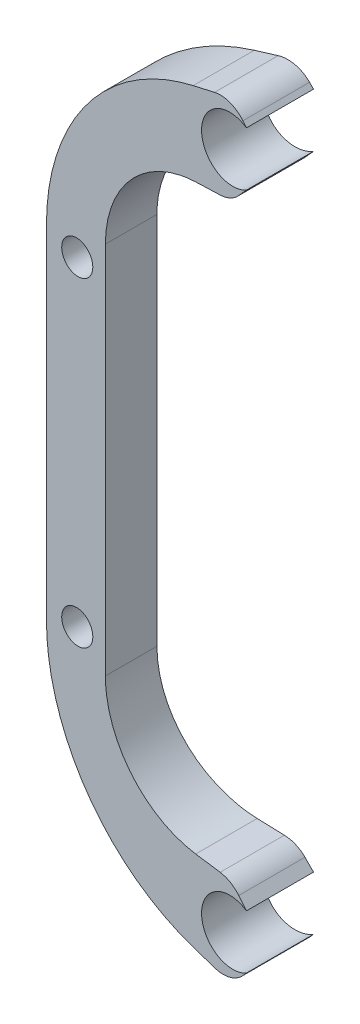
ISO-10303-21;
HEADER;
FILE_DESCRIPTION(('STEP AP214'),'2;1');
FILE_NAME('part.step','',(''),(''),'','','');
FILE_SCHEMA(('AUTOMOTIVE_DESIGN { 1 0 10303 214 1 1 1 1 }'));
ENDSEC;
DATA;
#1=APPLICATION_CONTEXT('core data for automotive mechanical design processes');
#2=APPLICATION_PROTOCOL_DEFINITION('international standard','automotive_design',2000,#1);
#3=PRODUCT_CONTEXT('',#1,'mechanical');
#4=PRODUCT('Part','Part','',(#3));
#5=PRODUCT_RELATED_PRODUCT_CATEGORY('part','',(#4));
#6=PRODUCT_DEFINITION_FORMATION('','',#4);
#7=PRODUCT_DEFINITION_CONTEXT('part definition',#1,'design');
#8=PRODUCT_DEFINITION('design','',#6,#7);
#9=PRODUCT_DEFINITION_SHAPE('','',#8);
#10=(LENGTH_UNIT() NAMED_UNIT(*) SI_UNIT(.MILLI.,.METRE.));
#11=(NAMED_UNIT(*) PLANE_ANGLE_UNIT() SI_UNIT($,.RADIAN.));
#12=(NAMED_UNIT(*) SI_UNIT($,.STERADIAN.) SOLID_ANGLE_UNIT());
#13=UNCERTAINTY_MEASURE_WITH_UNIT(LENGTH_MEASURE(1.E-05),#10,'distance_accuracy_value','');
#14=(GEOMETRIC_REPRESENTATION_CONTEXT(3) GLOBAL_UNCERTAINTY_ASSIGNED_CONTEXT((#13)) GLOBAL_UNIT_ASSIGNED_CONTEXT((#10,
#11,#12)) REPRESENTATION_CONTEXT('',''));
#15=CARTESIAN_POINT('',(0.,0.,0.));
#16=DIRECTION('',(0.,0.,1.));
#17=DIRECTION('',(1.,0.,0.));
#18=AXIS2_PLACEMENT_3D('',#15,#16,#17);
#19=CARTESIAN_POINT('',(6.01748699128147,16.7888100311249,4.5));
#20=DIRECTION('',(0.,0.,-1.));
#21=DIRECTION('',(-1.,0.,0.));
#22=AXIS2_PLACEMENT_3D('',#19,#20,#21);
#23=CYLINDRICAL_SURFACE('',#22,2.1);
#24=DIRECTION('',(0.,0.,-1.));
#25=VECTOR('',#24,1.);
#26=CARTESIAN_POINT('',(7.0893845411661,14.9829762506924,4.5));
#27=LINE('',#26,#25);
#28=CARTESIAN_POINT('',(7.0893845411661,14.9829762506924,4.5));
#29=VERTEX_POINT('',#28);
#30=CARTESIAN_POINT('',(7.0893845411661,14.9829762506924,0.));
#31=VERTEX_POINT('',#30);
#32=EDGE_CURVE('E219',#29,#31,#27,.T.);
#33=ORIENTED_EDGE('',*,*,#32,.T.);
#34=CARTESIAN_POINT('',(6.01748699128147,16.7888100311249,0.0561757702083878));
#35=DIRECTION('',(0.0523359562429444,0.,0.998629534754574));
#36=DIRECTION('',(0.998629534754574,0.,-0.0523359562429444));
#37=AXIS2_PLACEMENT_3D('',#34,#35,#36);
#38=ELLIPSE('',#37,2.10288192659563,2.1);
#39=CARTESIAN_POINT('',(7.0893845411661,18.5946438115575,0.));
#40=VERTEX_POINT('',#39);
#41=EDGE_CURVE('E364',#31,#40,#38,.F.);
#42=ORIENTED_EDGE('',*,*,#41,.T.);
#43=DIRECTION('',(0.,0.,-1.));
#44=VECTOR('',#43,1.);
#45=CARTESIAN_POINT('',(7.0893845411661,18.5946438115575,4.5));
#46=LINE('',#45,#44);
#47=CARTESIAN_POINT('',(7.0893845411661,18.5946438115575,4.5));
#48=VERTEX_POINT('',#47);
#49=EDGE_CURVE('E390',#48,#40,#46,.T.);
#50=ORIENTED_EDGE('',*,*,#49,.F.);
#51=CARTESIAN_POINT('',(6.01748699128147,16.7888100311249,4.44382422979162));
#52=DIRECTION('',(0.0523359562429369,0.,-0.998629534754574));
#53=DIRECTION('',(-0.998629534754574,0.,-0.0523359562429369));
#54=AXIS2_PLACEMENT_3D('',#51,#52,#53);
#55=ELLIPSE('',#54,2.10288192659563,2.1);
#56=EDGE_CURVE('E320',#48,#29,#55,.F.);
#57=ORIENTED_EDGE('',*,*,#56,.T.);
#58=EDGE_LOOP('',(#33,#42,#50,#57));
#59=FACE_BOUND('',#58,.T.);
#60=ADVANCED_FACE('F35',(#59),#23,.F.);
#61=CARTESIAN_POINT('',(5.0565748173918,15.7123807843522,4.5));
#62=DIRECTION('',(0.,0.,-1.));
#63=DIRECTION('',(-1.,0.,0.));
#64=AXIS2_PLACEMENT_3D('',#61,#62,#63);
#65=CYLINDRICAL_SURFACE('',#64,2.);
#66=CARTESIAN_POINT('',(5.0565748173918,15.7123807843522,0.106535043327985));
#67=DIRECTION('',(0.0523359562429444,0.,0.998629534754574));
#68=DIRECTION('',(0.998629534754574,0.,-0.0523359562429444));
#69=AXIS2_PLACEMENT_3D('',#66,#67,#68);
#70=ELLIPSE('',#69,2.00274469199584,2.);
#71=CARTESIAN_POINT('',(6.5449293244767,14.37641639065,0.0285336888257593));
#72=VERTEX_POINT('',#71);
#73=CARTESIAN_POINT('',(5.23088630288712,13.7199913881687,0.0973997654696475));
#74=VERTEX_POINT('',#73);
#75=EDGE_CURVE('E357',#72,#74,#70,.F.);
#76=ORIENTED_EDGE('',*,*,#75,.F.);
#77=DIRECTION('',(0.,0.,-1.));
#78=VECTOR('',#77,1.);
#79=CARTESIAN_POINT('',(6.5449293244767,14.37641639065,4.5));
#80=LINE('',#79,#78);
#81=CARTESIAN_POINT('',(6.5449293244767,14.37641639065,4.47146631117425));
#82=VERTEX_POINT('',#81);
#83=EDGE_CURVE('E249',#82,#72,#80,.T.);
#84=ORIENTED_EDGE('',*,*,#83,.F.);
#85=CARTESIAN_POINT('',(5.0565748173918,15.7123807843522,4.39346495667203));
#86=DIRECTION('',(0.0523359562429369,0.,-0.998629534754574));
#87=DIRECTION('',(-0.998629534754574,0.,-0.0523359562429369));
#88=AXIS2_PLACEMENT_3D('',#85,#86,#87);
#89=ELLIPSE('',#88,2.00274469199584,2.);
#90=CARTESIAN_POINT('',(5.23088630288712,13.7199913881687,4.40260023453037));
#91=VERTEX_POINT('',#90);
#92=EDGE_CURVE('E308',#91,#82,#89,.F.);
#93=ORIENTED_EDGE('',*,*,#92,.F.);
#94=DIRECTION('',(0.,0.,-1.));
#95=VECTOR('',#94,1.);
#96=CARTESIAN_POINT('',(5.23088630288712,13.7199913881687,4.5));
#97=LINE('',#96,#95);
#98=EDGE_CURVE('E252',#74,#91,#97,.F.);
#99=ORIENTED_EDGE('',*,*,#98,.F.);
#100=EDGE_LOOP('',(#76,#84,#93,#99));
#101=FACE_BOUND('',#100,.T.);
#102=ADVANCED_FACE('F402',(#101),#65,.T.);
#103=CARTESIAN_POINT('',(6.01748699128146,13.7888100311249,4.5));
#104=DIRECTION('',(-0.744177253542452,0.667982196851093,0.));
#105=DIRECTION('',(-0.667982196851093,-0.744177253542452,0.));
#106=AXIS2_PLACEMENT_3D('',#103,#104,#105);
#107=PLANE('',#106);
#108=ORIENTED_EDGE('',*,*,#83,.T.);
#109=DIRECTION('',(0.667573259077529,0.743721669260962,-0.034986032016996));
#110=VECTOR('',#109,1.);
#111=CARTESIAN_POINT('',(5.91369819056094,13.6731823017741,0.0616151107686001));
#112=LINE('',#111,#110);
#113=EDGE_CURVE('E361',#72,#31,#112,.T.);
#114=ORIENTED_EDGE('',*,*,#113,.T.);
#115=ORIENTED_EDGE('',*,*,#32,.F.);
#116=DIRECTION('',(-0.667573259077529,-0.743721669260962,-0.034986032016991));
#117=VECTOR('',#116,1.);
#118=CARTESIAN_POINT('',(6.01879901793193,13.7902717173703,4.44389299019473));
#119=LINE('',#118,#117);
#120=EDGE_CURVE('E312',#29,#82,#119,.T.);
#121=ORIENTED_EDGE('',*,*,#120,.T.);
#122=EDGE_LOOP('',(#108,#114,#115,#121));
#123=FACE_BOUND('',#122,.T.);
#124=ADVANCED_FACE('F397',(#123),#107,.F.);
#125=CARTESIAN_POINT('',(4.11252473120093,6.59540856611972,4.5));
#126=DIRECTION('',(0.,0.,1.));
#127=DIRECTION('',(1.,0.,0.));
#128=AXIS2_PLACEMENT_3D('',#125,#126,#127);
#129=CYLINDRICAL_SURFACE('',#128,7.);
#130=DIRECTION('',(0.,0.,-1.));
#131=VECTOR('',#130,1.);
#132=CARTESIAN_POINT('',(-2.88747526879907,6.59540856611972,4.5));
#133=LINE('',#132,#131);
#134=CARTESIAN_POINT('',(-2.88747526879907,6.59540856611972,0.522865066858506));
#135=VERTEX_POINT('',#134);
#136=CARTESIAN_POINT('',(-2.88747526879907,6.59540856611972,3.97713493314157));
#137=VERTEX_POINT('',#136);
#138=EDGE_CURVE('E225',#135,#137,#133,.F.);
#139=ORIENTED_EDGE('',*,*,#138,.F.);
#140=CARTESIAN_POINT('',(4.11252473120093,6.59540856611972,0.156010611877213));
#141=DIRECTION('',(0.0523359562429444,0.,0.998629534754574));
#142=DIRECTION('',(-0.998629534754574,0.,0.0523359562429444));
#143=AXIS2_PLACEMENT_3D('',#140,#141,#142);
#144=ELLIPSE('',#143,7.00960642198545,7.);
#145=CARTESIAN_POINT('',(3.50243453196729,13.5687714527619,0.187984084381396));
#146=VERTEX_POINT('',#145);
#147=EDGE_CURVE('E343',#135,#146,#144,.F.);
#148=ORIENTED_EDGE('',*,*,#147,.T.);
#149=DIRECTION('',(0.,0.,-1.));
#150=VECTOR('',#149,1.);
#151=CARTESIAN_POINT('',(3.50243453196729,13.5687714527619,0.));
#152=LINE('',#151,#150);
#153=CARTESIAN_POINT('',(3.50243453196729,13.5687714527619,4.31201591561863));
#154=VERTEX_POINT('',#153);
#155=EDGE_CURVE('E214',#154,#146,#152,.T.);
#156=ORIENTED_EDGE('',*,*,#155,.F.);
#157=CARTESIAN_POINT('',(4.11252473120093,6.59540856611972,4.34398938812281));
#158=DIRECTION('',(0.0523359562429369,0.,-0.998629534754574));
#159=DIRECTION('',(0.998629534754574,0.,0.0523359562429369));
#160=AXIS2_PLACEMENT_3D('',#157,#158,#159);
#161=ELLIPSE('',#160,7.00960642198544,7.);
#162=EDGE_CURVE('E295',#154,#137,#161,.F.);
#163=ORIENTED_EDGE('',*,*,#162,.T.);
#164=EDGE_LOOP('',(#139,#148,#156,#163));
#165=FACE_BOUND('',#164,.T.);
#166=ADVANCED_FACE('F409',(#165),#129,.F.);
#167=CARTESIAN_POINT('',(-2.88747526879907,13.0097267842417,4.5));
#168=DIRECTION('',(-0.0871557427476618,0.996194698091745,0.));
#169=DIRECTION('',(-0.996194698091745,-0.0871557427476618,0.));
#170=AXIS2_PLACEMENT_3D('',#167,#168,#169);
#171=PLANE('',#170);
#172=ORIENTED_EDGE('',*,*,#155,.T.);
#173=DIRECTION('',(0.994839797341938,0.0870372042918509,-0.0521373445210823));
#174=VECTOR('',#173,1.);
#175=CARTESIAN_POINT('',(-3.09376251756073,12.9916789885451,0.533676123460512));
#176=LINE('',#175,#174);
#177=EDGE_CURVE('E351',#146,#74,#176,.T.);
#178=ORIENTED_EDGE('',*,*,#177,.T.);
#179=ORIENTED_EDGE('',*,*,#98,.T.);
#180=DIRECTION('',(-0.994839797341939,-0.087037204291851,-0.0521373445210748));
#181=VECTOR('',#180,1.);
#182=CARTESIAN_POINT('',(-2.86035514390288,13.0120994877235,3.97855623866126));
#183=LINE('',#182,#181);
#184=EDGE_CURVE('E302',#91,#154,#183,.T.);
#185=ORIENTED_EDGE('',*,*,#184,.T.);
#186=EDGE_LOOP('',(#172,#178,#179,#185));
#187=FACE_BOUND('',#186,.T.);
#188=ADVANCED_FACE('F405',(#187),#171,.F.);
#189=CARTESIAN_POINT('',(4.11252473120093,-18.4777885038699,4.5));
#190=DIRECTION('',(0.,0.,1.));
#191=DIRECTION('',(1.,0.,0.));
#192=AXIS2_PLACEMENT_3D('',#189,#190,#191);
#193=CYLINDRICAL_SURFACE('',#192,7.);
#194=DIRECTION('',(0.,0.,-1.));
#195=VECTOR('',#194,1.);
#196=CARTESIAN_POINT('',(3.50243453196729,-25.4511513905121,4.5));
#197=LINE('',#196,#195);
#198=CARTESIAN_POINT('',(3.50243453196729,-25.4511513905121,0.187984084381396));
#199=VERTEX_POINT('',#198);
#200=CARTESIAN_POINT('',(3.50243453196729,-25.4511513905121,4.31201591561863));
#201=VERTEX_POINT('',#200);
#202=EDGE_CURVE('E228',#199,#201,#197,.F.);
#203=ORIENTED_EDGE('',*,*,#202,.F.);
#204=CARTESIAN_POINT('',(4.11252473120093,-18.4777885038699,0.156010611877213));
#205=DIRECTION('',(0.0523359562429444,0.,0.998629534754574));
#206=DIRECTION('',(-0.998629534754574,0.,0.0523359562429444));
#207=AXIS2_PLACEMENT_3D('',#204,#205,#206);
#208=ELLIPSE('',#207,7.00960642198545,7.);
#209=CARTESIAN_POINT('',(-2.88747526879907,-18.4777885038699,0.522865066858505));
#210=VERTEX_POINT('',#209);
#211=EDGE_CURVE('E340',#199,#210,#208,.F.);
#212=ORIENTED_EDGE('',*,*,#211,.T.);
#213=DIRECTION('',(0.,0.,-1.));
#214=VECTOR('',#213,1.);
#215=CARTESIAN_POINT('',(-2.88747526879907,-18.4777885038699,0.));
#216=LINE('',#215,#214);
#217=CARTESIAN_POINT('',(-2.88747526879907,-18.4777885038699,3.97713493314157));
#218=VERTEX_POINT('',#217);
#219=EDGE_CURVE('E217',#218,#210,#216,.T.);
#220=ORIENTED_EDGE('',*,*,#219,.F.);
#221=CARTESIAN_POINT('',(4.11252473120093,-18.4777885038699,4.34398938812281));
#222=DIRECTION('',(0.0523359562429369,0.,-0.998629534754574));
#223=DIRECTION('',(0.998629534754574,0.,0.0523359562429369));
#224=AXIS2_PLACEMENT_3D('',#221,#222,#223);
#225=ELLIPSE('',#224,7.00960642198544,7.);
#226=EDGE_CURVE('E198',#218,#201,#225,.F.);
#227=ORIENTED_EDGE('',*,*,#226,.T.);
#228=EDGE_LOOP('',(#203,#212,#220,#227));
#229=FACE_BOUND('',#228,.T.);
#230=ADVANCED_FACE('F414',(#229),#193,.F.);
#231=CARTESIAN_POINT('',(-2.88747526879907,-24.8921067219918,4.5));
#232=DIRECTION('',(-1.,0.,0.));
#233=DIRECTION('',(0.,-1.,0.));
#234=AXIS2_PLACEMENT_3D('',#231,#232,#233);
#235=PLANE('',#234);
#236=ORIENTED_EDGE('',*,*,#219,.T.);
#237=DIRECTION('',(0.,1.,0.));
#238=VECTOR('',#237,1.);
#239=CARTESIAN_POINT('',(-2.88747526879907,-24.8921067219918,0.522865066858506));
#240=LINE('',#239,#238);
#241=EDGE_CURVE('E344',#210,#135,#240,.T.);
#242=ORIENTED_EDGE('',*,*,#241,.T.);
#243=ORIENTED_EDGE('',*,*,#138,.T.);
#244=DIRECTION('',(0.,-1.,0.));
#245=VECTOR('',#244,1.);
#246=CARTESIAN_POINT('',(-2.88747526879907,-24.8921067219918,3.97713493314157));
#247=LINE('',#246,#245);
#248=EDGE_CURVE('E296',#137,#218,#247,.T.);
#249=ORIENTED_EDGE('',*,*,#248,.T.);
#250=EDGE_LOOP('',(#236,#242,#243,#249));
#251=FACE_BOUND('',#250,.T.);
#252=ADVANCED_FACE('F411',(#251),#235,.F.);
#253=CARTESIAN_POINT('',(5.0565748173918,-27.5947607221024,4.5));
#254=DIRECTION('',(0.,0.,-1.));
#255=DIRECTION('',(-1.,0.,0.));
#256=AXIS2_PLACEMENT_3D('',#253,#254,#255);
#257=CYLINDRICAL_SURFACE('',#256,2.);
#258=CARTESIAN_POINT('',(5.0565748173918,-27.5947607221024,0.106535043327985));
#259=DIRECTION('',(0.0523359562429444,0.,0.998629534754574));
#260=DIRECTION('',(0.998629534754574,0.,-0.0523359562429444));
#261=AXIS2_PLACEMENT_3D('',#258,#259,#260);
#262=ELLIPSE('',#261,2.00274469199584,2.);
#263=CARTESIAN_POINT('',(5.23088630288713,-25.6023713259189,0.0973997654696466));
#264=VERTEX_POINT('',#263);
#265=CARTESIAN_POINT('',(6.54492932447671,-26.2587963284002,0.0285336888257593));
#266=VERTEX_POINT('',#265);
#267=EDGE_CURVE('E43',#264,#266,#262,.F.);
#268=ORIENTED_EDGE('',*,*,#267,.F.);
#269=DIRECTION('',(0.,0.,-1.));
#270=VECTOR('',#269,1.);
#271=CARTESIAN_POINT('',(5.23088630288713,-25.6023713259189,4.5));
#272=LINE('',#271,#270);
#273=CARTESIAN_POINT('',(5.23088630288713,-25.6023713259189,4.40260023453037));
#274=VERTEX_POINT('',#273);
#275=EDGE_CURVE('E260',#274,#264,#272,.T.);
#276=ORIENTED_EDGE('',*,*,#275,.F.);
#277=CARTESIAN_POINT('',(5.0565748173918,-27.5947607221024,4.39346495667203));
#278=DIRECTION('',(0.0523359562429369,0.,-0.998629534754574));
#279=DIRECTION('',(-0.998629534754574,0.,-0.0523359562429369));
#280=AXIS2_PLACEMENT_3D('',#277,#278,#279);
#281=ELLIPSE('',#280,2.00274469199584,2.);
#282=CARTESIAN_POINT('',(6.54492932447671,-26.2587963284002,4.47146631117424));
#283=VERTEX_POINT('',#282);
#284=EDGE_CURVE('E266',#283,#274,#281,.F.);
#285=ORIENTED_EDGE('',*,*,#284,.F.);
#286=DIRECTION('',(0.,0.,-1.));
#287=VECTOR('',#286,1.);
#288=CARTESIAN_POINT('',(6.54492932447671,-26.2587963284002,4.5));
#289=LINE('',#288,#287);
#290=EDGE_CURVE('E263',#266,#283,#289,.F.);
#291=ORIENTED_EDGE('',*,*,#290,.F.);
#292=EDGE_LOOP('',(#268,#276,#285,#291));
#293=FACE_BOUND('',#292,.T.);
#294=ADVANCED_FACE('F37',(#293),#257,.T.);
#295=CARTESIAN_POINT('',(6.01748699128147,-25.6711899688751,4.5));
#296=DIRECTION('',(-0.0871557427476625,-0.996194698091745,0.));
#297=DIRECTION('',(0.996194698091745,-0.0871557427476625,0.));
#298=AXIS2_PLACEMENT_3D('',#295,#296,#297);
#299=PLANE('',#298);
#300=ORIENTED_EDGE('',*,*,#275,.T.);
#301=DIRECTION('',(-0.994839797341938,0.0870372042918516,0.0521373445210823));
#302=VECTOR('',#301,1.);
#303=CARTESIAN_POINT('',(5.78699335962085,-25.6510243890899,0.0682554295826036));
#304=LINE('',#303,#302);
#305=EDGE_CURVE('E273',#264,#199,#304,.T.);
#306=ORIENTED_EDGE('',*,*,#305,.T.);
#307=ORIENTED_EDGE('',*,*,#202,.T.);
#308=DIRECTION('',(0.994839797341938,-0.0870372042918516,0.0521373445210748));
#309=VECTOR('',#308,1.);
#310=CARTESIAN_POINT('',(6.0204007332787,-25.6714448882683,4.4439769325391));
#311=LINE('',#310,#309);
#312=EDGE_CURVE('E283',#201,#274,#311,.T.);
#313=ORIENTED_EDGE('',*,*,#312,.T.);
#314=EDGE_LOOP('',(#300,#306,#307,#313));
#315=FACE_BOUND('',#314,.T.);
#316=ADVANCED_FACE('F286',(#315),#299,.F.);
#317=CARTESIAN_POINT('',(6.01748699128147,-25.6711899688751,4.5));
#318=DIRECTION('',(-0.744177253542451,-0.667982196851094,0.));
#319=DIRECTION('',(0.667982196851094,-0.744177253542451,0.));
#320=AXIS2_PLACEMENT_3D('',#317,#318,#319);
#321=PLANE('',#320);
#322=DIRECTION('',(0.,0.,-1.));
#323=VECTOR('',#322,1.);
#324=CARTESIAN_POINT('',(7.0893845411661,-26.8653561884425,4.5));
#325=LINE('',#324,#323);
#326=CARTESIAN_POINT('',(7.0893845411661,-26.8653561884425,4.5));
#327=VERTEX_POINT('',#326);
#328=CARTESIAN_POINT('',(7.0893845411661,-26.8653561884425,0.));
#329=VERTEX_POINT('',#328);
#330=EDGE_CURVE('E207',#327,#329,#325,.T.);
#331=ORIENTED_EDGE('',*,*,#330,.T.);
#332=DIRECTION('',(-0.66757325907753,0.743721669260961,0.034986032016996));
#333=VECTOR('',#332,1.);
#334=CARTESIAN_POINT('',(5.91369819056094,-25.5555622395243,0.0616151107685993));
#335=LINE('',#334,#333);
#336=EDGE_CURVE('E271',#329,#266,#335,.T.);
#337=ORIENTED_EDGE('',*,*,#336,.T.);
#338=ORIENTED_EDGE('',*,*,#290,.T.);
#339=DIRECTION('',(0.66757325907753,-0.743721669260961,0.034986032016991));
#340=VECTOR('',#339,1.);
#341=CARTESIAN_POINT('',(6.01879901793194,-25.6726516551205,4.44389299019473));
#342=LINE('',#341,#340);
#343=EDGE_CURVE('E208',#283,#327,#342,.T.);
#344=ORIENTED_EDGE('',*,*,#343,.T.);
#345=EDGE_LOOP('',(#331,#337,#338,#344));
#346=FACE_BOUND('',#345,.T.);
#347=ADVANCED_FACE('F278',(#346),#321,.F.);
#348=CARTESIAN_POINT('',(6.01748699128147,-28.6711899688751,4.5));
#349=DIRECTION('',(0.,0.,-1.));
#350=DIRECTION('',(-1.,0.,0.));
#351=AXIS2_PLACEMENT_3D('',#348,#349,#350);
#352=CYLINDRICAL_SURFACE('',#351,2.1);
#353=DIRECTION('',(0.,0.,-1.));
#354=VECTOR('',#353,1.);
#355=CARTESIAN_POINT('',(7.0893845411661,-30.4770237493076,4.5));
#356=LINE('',#355,#354);
#357=CARTESIAN_POINT('',(7.0893845411661,-30.4770237493076,4.5));
#358=VERTEX_POINT('',#357);
#359=CARTESIAN_POINT('',(7.0893845411661,-30.4770237493076,0.));
#360=VERTEX_POINT('',#359);
#361=EDGE_CURVE('E205',#358,#360,#356,.T.);
#362=ORIENTED_EDGE('',*,*,#361,.T.);
#363=CARTESIAN_POINT('',(6.01748699128147,-28.6711899688751,0.056175770208387));
#364=DIRECTION('',(0.0523359562429444,0.,0.998629534754574));
#365=DIRECTION('',(0.998629534754574,0.,-0.0523359562429444));
#366=AXIS2_PLACEMENT_3D('',#363,#364,#365);
#367=ELLIPSE('',#366,2.10288192659563,2.1);
#368=EDGE_CURVE('E279',#360,#329,#367,.F.);
#369=ORIENTED_EDGE('',*,*,#368,.T.);
#370=ORIENTED_EDGE('',*,*,#330,.F.);
#371=CARTESIAN_POINT('',(6.01748699128147,-28.6711899688751,4.44382422979162));
#372=DIRECTION('',(0.0523359562429369,0.,-0.998629534754574));
#373=DIRECTION('',(-0.998629534754574,0.,-0.0523359562429369));
#374=AXIS2_PLACEMENT_3D('',#371,#372,#373);
#375=ELLIPSE('',#374,2.10288192659563,2.1);
#376=EDGE_CURVE('E190',#327,#358,#375,.F.);
#377=ORIENTED_EDGE('',*,*,#376,.T.);
#378=EDGE_LOOP('',(#362,#369,#370,#377));
#379=FACE_BOUND('',#378,.T.);
#380=ADVANCED_FACE('F203',(#379),#352,.F.);
#381=CARTESIAN_POINT('',(5.34923209998126,-29.4215792495929,4.5));
#382=DIRECTION('',(0.,0.,-1.));
#383=DIRECTION('',(-1.,0.,0.));
#384=AXIS2_PLACEMENT_3D('',#381,#382,#383);
#385=CYLINDRICAL_SURFACE('',#384,2.);
#386=CARTESIAN_POINT('',(5.34923209998126,-29.4215792495929,0.0911975250564622));
#387=DIRECTION('',(0.0523359562429444,0.,0.998629534754574));
#388=DIRECTION('',(0.998629534754574,0.,-0.0523359562429444));
#389=AXIS2_PLACEMENT_3D('',#386,#387,#388);
#390=ELLIPSE('',#389,2.00274469199584,2.);
#391=CARTESIAN_POINT('',(6.83758660706616,-30.757543643295,0.0131961705542352));
#392=VERTEX_POINT('',#391);
#393=CARTESIAN_POINT('',(4.83159400977621,-31.353430902171,0.118325787836424));
#394=VERTEX_POINT('',#393);
#395=EDGE_CURVE('E341',#392,#394,#390,.F.);
#396=ORIENTED_EDGE('',*,*,#395,.F.);
#397=DIRECTION('',(0.,0.,-1.));
#398=VECTOR('',#397,1.);
#399=CARTESIAN_POINT('',(6.83758660706616,-30.757543643295,4.5));
#400=LINE('',#399,#398);
#401=CARTESIAN_POINT('',(6.83758660706616,-30.757543643295,4.48680382944577));
#402=VERTEX_POINT('',#401);
#403=EDGE_CURVE('E255',#402,#392,#400,.T.);
#404=ORIENTED_EDGE('',*,*,#403,.F.);
#405=CARTESIAN_POINT('',(5.34923209998126,-29.4215792495929,4.40880247494355));
#406=DIRECTION('',(0.0523359562429369,0.,-0.998629534754574));
#407=DIRECTION('',(-0.998629534754574,0.,-0.0523359562429369));
#408=AXIS2_PLACEMENT_3D('',#405,#406,#407);
#409=ELLIPSE('',#408,2.00274469199584,2.);
#410=CARTESIAN_POINT('',(4.83159400977621,-31.353430902171,4.38167421216359));
#411=VERTEX_POINT('',#410);
#412=EDGE_CURVE('E193',#411,#402,#409,.F.);
#413=ORIENTED_EDGE('',*,*,#412,.F.);
#414=DIRECTION('',(0.,0.,-1.));
#415=VECTOR('',#414,1.);
#416=CARTESIAN_POINT('',(4.83159400977621,-31.353430902171,4.5));
#417=LINE('',#416,#415);
#418=EDGE_CURVE('E257',#394,#411,#417,.F.);
#419=ORIENTED_EDGE('',*,*,#418,.F.);
#420=EDGE_LOOP('',(#396,#404,#413,#419));
#421=FACE_BOUND('',#420,.T.);
#422=ADVANCED_FACE('F445',(#421),#385,.T.);
#423=CARTESIAN_POINT('',(7.0893845411661,-30.4770237493076,4.5));
#424=DIRECTION('',(-0.744177253542452,0.667982196851093,0.));
#425=DIRECTION('',(-0.667982196851093,-0.744177253542452,0.));
#426=AXIS2_PLACEMENT_3D('',#423,#424,#425);
#427=PLANE('',#426);
#428=ORIENTED_EDGE('',*,*,#403,.T.);
#429=DIRECTION('',(0.667573259077529,0.743721669260962,-0.034986032016996));
#430=VECTOR('',#429,1.);
#431=CARTESIAN_POINT('',(6.9842837137951,-30.5941131649039,0.00550810096332406));
#432=LINE('',#431,#430);
#433=EDGE_CURVE('E213',#392,#360,#432,.T.);
#434=ORIENTED_EDGE('',*,*,#433,.T.);
#435=ORIENTED_EDGE('',*,*,#361,.F.);
#436=DIRECTION('',(-0.667573259077529,-0.743721669260962,-0.034986032016991));
#437=VECTOR('',#436,1.);
#438=CARTESIAN_POINT('',(7.0893845411661,-30.4770237493076,4.5));
#439=LINE('',#438,#437);
#440=EDGE_CURVE('E187',#358,#402,#439,.T.);
#441=ORIENTED_EDGE('',*,*,#440,.T.);
#442=EDGE_LOOP('',(#428,#434,#435,#441));
#443=FACE_BOUND('',#442,.T.);
#444=ADVANCED_FACE('F211',(#443),#427,.F.);
#445=CARTESIAN_POINT('',(6.94245060539237,-17.4251666965631,4.5));
#446=DIRECTION('',(0.,0.,-1.));
#447=DIRECTION('',(-1.,0.,0.));
#448=AXIS2_PLACEMENT_3D('',#445,#446,#447);
#449=CYLINDRICAL_SURFACE('',#448,14.);
#450=CARTESIAN_POINT('',(6.94245060539237,-17.4251666965631,0.00770048127521784));
#451=DIRECTION('',(0.0523359562429444,0.,0.998629534754574));
#452=DIRECTION('',(0.998629534754574,0.,-0.0523359562429444));
#453=AXIS2_PLACEMENT_3D('',#450,#451,#452);
#454=ELLIPSE('',#453,14.0192128439709,14.);
#455=CARTESIAN_POINT('',(3.31898397395703,-30.94812826461,0.197598320734948));
#456=VERTEX_POINT('',#455);
#457=CARTESIAN_POINT('',(-4.92877379935626,-24.8463546831391,0.629844989698743));
#458=VERTEX_POINT('',#457);
#459=EDGE_CURVE('E359',#456,#458,#454,.F.);
#460=ORIENTED_EDGE('',*,*,#459,.F.);
#461=DIRECTION('',(0.,0.,-1.));
#462=VECTOR('',#461,1.);
#463=CARTESIAN_POINT('',(3.31898397395703,-30.94812826461,4.5));
#464=LINE('',#463,#462);
#465=CARTESIAN_POINT('',(3.31898397395703,-30.94812826461,4.30240167926508));
#466=VERTEX_POINT('',#465);
#467=EDGE_CURVE('E240',#466,#456,#464,.T.);
#468=ORIENTED_EDGE('',*,*,#467,.F.);
#469=CARTESIAN_POINT('',(6.94245060539237,-17.4251666965631,4.49229951872478));
#470=DIRECTION('',(0.0523359562429369,0.,-0.998629534754574));
#471=DIRECTION('',(-0.998629534754574,0.,-0.0523359562429369));
#472=AXIS2_PLACEMENT_3D('',#469,#470,#471);
#473=ELLIPSE('',#472,14.0192128439709,14.);
#474=CARTESIAN_POINT('',(-7.05754939460763,-17.4251666965631,3.7585906087623));
#475=VERTEX_POINT('',#474);
#476=EDGE_CURVE('E310',#475,#466,#473,.F.);
#477=ORIENTED_EDGE('',*,*,#476,.F.);
#478=DIRECTION('',(0.,0.,-1.));
#479=VECTOR('',#478,1.);
#480=CARTESIAN_POINT('',(-7.05754939460763,-17.4251666965631,4.5));
#481=LINE('',#480,#479);
#482=CARTESIAN_POINT('',(-7.05754939460763,-17.4251666965631,0.629844989698743));
#483=VERTEX_POINT('',#482);
#484=EDGE_CURVE('E231',#483,#475,#481,.F.);
#485=ORIENTED_EDGE('',*,*,#484,.F.);
#486=CARTESIAN_POINT('',(6.94245060539237,-17.4251666965631,0.629844989698741));
#487=DIRECTION('',(0.,0.,1.));
#488=DIRECTION('',(1.,0.,0.));
#489=AXIS2_PLACEMENT_3D('',#486,#487,#488);
#490=CIRCLE('',#489,14.);
#491=EDGE_CURVE('E11',#458,#483,#490,.F.);
#492=ORIENTED_EDGE('',*,*,#491,.F.);
#493=EDGE_LOOP('',(#460,#468,#477,#485,#492));
#494=FACE_BOUND('',#493,.T.);
#495=ADVANCED_FACE('F439',(#494),#449,.T.);
#496=CARTESIAN_POINT('',(6.01748699128147,-31.6711899688751,4.5));
#497=DIRECTION('',(0.258819045102525,0.965925826289067,0.));
#498=DIRECTION('',(-0.965925826289067,0.258819045102525,0.));
#499=AXIS2_PLACEMENT_3D('',#496,#497,#498);
#500=PLANE('',#499);
#501=ORIENTED_EDGE('',*,*,#467,.T.);
#502=DIRECTION('',(0.964690564113554,-0.258488057600155,-0.0505572901604961));
#503=VECTOR('',#502,1.);
#504=CARTESIAN_POINT('',(5.80075217041124,-31.6131160486512,0.0675343608635033));
#505=LINE('',#504,#503);
#506=EDGE_CURVE('E354',#456,#394,#505,.T.);
#507=ORIENTED_EDGE('',*,*,#506,.T.);
#508=ORIENTED_EDGE('',*,*,#418,.T.);
#509=DIRECTION('',(-0.964690564113554,0.258488057600155,-0.0505572901604889));
#510=VECTOR('',#509,1.);
#511=CARTESIAN_POINT('',(6.02022680385365,-31.6719240994412,4.44396781728418));
#512=LINE('',#511,#510);
#513=EDGE_CURVE('E305',#411,#466,#512,.T.);
#514=ORIENTED_EDGE('',*,*,#513,.T.);
#515=EDGE_LOOP('',(#501,#507,#508,#514));
#516=FACE_BOUND('',#515,.T.);
#517=ADVANCED_FACE('F442',(#516),#500,.F.);
#518=CARTESIAN_POINT('',(6.94245060539237,5.54278675881298,4.5));
#519=DIRECTION('',(0.,0.,-1.));
#520=DIRECTION('',(-1.,0.,0.));
#521=AXIS2_PLACEMENT_3D('',#518,#519,#520);
#522=CYLINDRICAL_SURFACE('',#521,14.);
#523=CARTESIAN_POINT('',(6.94245060539237,5.54278675881298,0.00770048127521784));
#524=DIRECTION('',(0.0523359562429444,0.,0.998629534754574));
#525=DIRECTION('',(0.998629534754574,0.,-0.0523359562429444));
#526=AXIS2_PLACEMENT_3D('',#523,#524,#525);
#527=ELLIPSE('',#526,14.0192128439709,14.);
#528=CARTESIAN_POINT('',(-4.92877379935626,12.963974745389,0.629844989698743));
#529=VERTEX_POINT('',#528);
#530=CARTESIAN_POINT('',(3.31898397395713,19.0657483268599,0.197598320734943));
#531=VERTEX_POINT('',#530);
#532=EDGE_CURVE('E375',#529,#531,#527,.F.);
#533=ORIENTED_EDGE('',*,*,#532,.F.);
#534=CARTESIAN_POINT('',(6.94245060539237,5.54278675881298,0.629844989698741));
#535=DIRECTION('',(0.,0.,1.));
#536=DIRECTION('',(1.,0.,0.));
#537=AXIS2_PLACEMENT_3D('',#534,#535,#536);
#538=CIRCLE('',#537,14.);
#539=CARTESIAN_POINT('',(-7.05754939460763,5.54278675881298,0.629844989698743));
#540=VERTEX_POINT('',#539);
#541=EDGE_CURVE('E384',#540,#529,#538,.F.);
#542=ORIENTED_EDGE('',*,*,#541,.F.);
#543=DIRECTION('',(0.,0.,-1.));
#544=VECTOR('',#543,1.);
#545=CARTESIAN_POINT('',(-7.05754939460763,5.54278675881298,4.5));
#546=LINE('',#545,#544);
#547=CARTESIAN_POINT('',(-7.05754939460763,5.54278675881298,3.7585906087623));
#548=VERTEX_POINT('',#547);
#549=EDGE_CURVE('E234',#548,#540,#546,.T.);
#550=ORIENTED_EDGE('',*,*,#549,.F.);
#551=CARTESIAN_POINT('',(6.94245060539237,5.54278675881298,4.49229951872478));
#552=DIRECTION('',(0.0523359562429369,0.,-0.998629534754574));
#553=DIRECTION('',(-0.998629534754574,0.,-0.0523359562429369));
#554=AXIS2_PLACEMENT_3D('',#551,#552,#553);
#555=ELLIPSE('',#554,14.0192128439709,14.);
#556=CARTESIAN_POINT('',(3.31898397395713,19.0657483268599,4.30240167926508));
#557=VERTEX_POINT('',#556);
#558=EDGE_CURVE('E318',#557,#548,#555,.F.);
#559=ORIENTED_EDGE('',*,*,#558,.F.);
#560=DIRECTION('',(0.,0.,-1.));
#561=VECTOR('',#560,1.);
#562=CARTESIAN_POINT('',(3.31898397395713,19.0657483268599,4.5));
#563=LINE('',#562,#561);
#564=EDGE_CURVE('E237',#531,#557,#563,.F.);
#565=ORIENTED_EDGE('',*,*,#564,.F.);
#566=EDGE_LOOP('',(#533,#542,#550,#559,#565));
#567=FACE_BOUND('',#566,.T.);
#568=ADVANCED_FACE('F429',(#567),#522,.T.);
#569=CARTESIAN_POINT('',(-7.05754939460763,-28.1677445282685,4.5));
#570=DIRECTION('',(1.,0.,0.));
#571=DIRECTION('',(0.,0.,-1.));
#572=AXIS2_PLACEMENT_3D('',#569,#570,#571);
#573=PLANE('',#572);
#574=ORIENTED_EDGE('',*,*,#549,.T.);
#575=DIRECTION('',(0.,-1.,0.));
#576=VECTOR('',#575,1.);
#577=CARTESIAN_POINT('',(-7.05754939460763,-28.1677445282685,0.629844989698743));
#578=LINE('',#577,#576);
#579=EDGE_CURVE('E381',#540,#483,#578,.T.);
#580=ORIENTED_EDGE('',*,*,#579,.T.);
#581=ORIENTED_EDGE('',*,*,#484,.T.);
#582=DIRECTION('',(0.,1.,0.));
#583=VECTOR('',#582,1.);
#584=CARTESIAN_POINT('',(-7.05754939460763,-28.1677445282685,3.7585906087623));
#585=LINE('',#584,#583);
#586=EDGE_CURVE('E315',#475,#548,#585,.T.);
#587=ORIENTED_EDGE('',*,*,#586,.T.);
#588=EDGE_LOOP('',(#574,#580,#581,#587));
#589=FACE_BOUND('',#588,.T.);
#590=ADVANCED_FACE('F434',(#589),#573,.F.);
#591=CARTESIAN_POINT('',(5.34923209998125,17.5391993118427,4.5));
#592=DIRECTION('',(0.,0.,-1.));
#593=DIRECTION('',(-1.,0.,0.));
#594=AXIS2_PLACEMENT_3D('',#591,#592,#593);
#595=CYLINDRICAL_SURFACE('',#594,2.);
#596=CARTESIAN_POINT('',(5.34923209998125,17.5391993118427,0.0911975250564622));
#597=DIRECTION('',(0.0523359562429444,0.,0.998629534754574));
#598=DIRECTION('',(0.998629534754574,0.,-0.0523359562429444));
#599=AXIS2_PLACEMENT_3D('',#596,#597,#598);
#600=ELLIPSE('',#599,2.00274469199584,2.);
#601=CARTESIAN_POINT('',(4.83159400977621,19.4710509644209,0.118325787836423));
#602=VERTEX_POINT('',#601);
#603=CARTESIAN_POINT('',(6.83758660706615,18.8751637055449,0.013196170554236));
#604=VERTEX_POINT('',#603);
#605=EDGE_CURVE('E370',#602,#604,#600,.F.);
#606=ORIENTED_EDGE('',*,*,#605,.F.);
#607=DIRECTION('',(0.,0.,-1.));
#608=VECTOR('',#607,1.);
#609=CARTESIAN_POINT('',(4.83159400977621,19.4710509644209,4.5));
#610=LINE('',#609,#608);
#611=CARTESIAN_POINT('',(4.83159400977621,19.4710509644209,4.38167421216359));
#612=VERTEX_POINT('',#611);
#613=EDGE_CURVE('E243',#612,#602,#610,.T.);
#614=ORIENTED_EDGE('',*,*,#613,.F.);
#615=CARTESIAN_POINT('',(5.34923209998125,17.5391993118427,4.40880247494355));
#616=DIRECTION('',(0.0523359562429369,0.,-0.998629534754574));
#617=DIRECTION('',(-0.998629534754574,0.,-0.0523359562429369));
#618=AXIS2_PLACEMENT_3D('',#615,#616,#617);
#619=ELLIPSE('',#618,2.00274469199584,2.);
#620=CARTESIAN_POINT('',(6.83758660706615,18.8751637055449,4.48680382944576));
#621=VERTEX_POINT('',#620);
#622=EDGE_CURVE('E329',#621,#612,#619,.F.);
#623=ORIENTED_EDGE('',*,*,#622,.F.);
#624=DIRECTION('',(0.,0.,-1.));
#625=VECTOR('',#624,1.);
#626=CARTESIAN_POINT('',(6.83758660706615,18.8751637055449,4.5));
#627=LINE('',#626,#625);
#628=EDGE_CURVE('E246',#604,#621,#627,.F.);
#629=ORIENTED_EDGE('',*,*,#628,.F.);
#630=EDGE_LOOP('',(#606,#614,#623,#629));
#631=FACE_BOUND('',#630,.T.);
#632=ADVANCED_FACE('F421',(#631),#595,.T.);
#633=CARTESIAN_POINT('',(6.01748699128146,19.7888100311249,4.5));
#634=DIRECTION('',(0.258819045102518,-0.965925826289069,0.));
#635=DIRECTION('',(0.965925826289069,0.258819045102518,0.));
#636=AXIS2_PLACEMENT_3D('',#633,#634,#635);
#637=PLANE('',#636);
#638=ORIENTED_EDGE('',*,*,#613,.T.);
#639=DIRECTION('',(-0.964690564113555,-0.258488057600148,0.0505572901604962));
#640=VECTOR('',#639,1.);
#641=CARTESIAN_POINT('',(5.80075217041123,19.730736110901,0.0675343608635042));
#642=LINE('',#641,#640);
#643=EDGE_CURVE('E372',#602,#531,#642,.T.);
#644=ORIENTED_EDGE('',*,*,#643,.T.);
#645=ORIENTED_EDGE('',*,*,#564,.T.);
#646=DIRECTION('',(0.964690564113556,0.258488057600148,0.050557290160489));
#647=VECTOR('',#646,1.);
#648=CARTESIAN_POINT('',(6.02022680385365,19.7895441616911,4.44396781728418));
#649=LINE('',#648,#647);
#650=EDGE_CURVE('E323',#557,#612,#649,.T.);
#651=ORIENTED_EDGE('',*,*,#650,.T.);
#652=EDGE_LOOP('',(#638,#644,#645,#651));
#653=FACE_BOUND('',#652,.T.);
#654=ADVANCED_FACE('F425',(#653),#637,.F.);
#655=CARTESIAN_POINT('',(6.01748699128146,19.7888100311249,4.5));
#656=DIRECTION('',(-0.744177253542452,-0.667982196851093,0.));
#657=DIRECTION('',(0.667982196851093,-0.744177253542452,0.));
#658=AXIS2_PLACEMENT_3D('',#655,#656,#657);
#659=PLANE('',#658);
#660=ORIENTED_EDGE('',*,*,#49,.T.);
#661=DIRECTION('',(-0.667573259077529,0.743721669260962,0.034986032016996));
#662=VECTOR('',#661,1.);
#663=CARTESIAN_POINT('',(5.91369819056094,19.9044377604758,0.0616151107686001));
#664=LINE('',#663,#662);
#665=EDGE_CURVE('E367',#40,#604,#664,.T.);
#666=ORIENTED_EDGE('',*,*,#665,.T.);
#667=ORIENTED_EDGE('',*,*,#628,.T.);
#668=DIRECTION('',(0.667573259077529,-0.743721669260962,0.034986032016991));
#669=VECTOR('',#668,1.);
#670=CARTESIAN_POINT('',(6.01879901793193,19.7873483448795,4.44389299019473));
#671=LINE('',#670,#669);
#672=EDGE_CURVE('E326',#621,#48,#671,.T.);
#673=ORIENTED_EDGE('',*,*,#672,.T.);
#674=EDGE_LOOP('',(#660,#666,#667,#673));
#675=FACE_BOUND('',#674,.T.);
#676=ADVANCED_FACE('F417',(#675),#659,.F.);
#677=CARTESIAN_POINT('',(7.0893845411661,-31.4215792495929,4.5));
#678=DIRECTION('',(0.0523359562429369,0.,-0.998629534754574));
#679=DIRECTION('',(-0.998629534754574,0.,-0.0523359562429369));
#680=AXIS2_PLACEMENT_3D('',#677,#678,#679);
#681=PLANE('',#680);
#682=CARTESIAN_POINT('',(-4.8791524632151,-16.6711899688751,3.87275555433356));
#683=DIRECTION('',(0.0523359562429369,0.,-0.998629534754574));
#684=DIRECTION('',(-0.998629534754574,0.,-0.0523359562429369));
#685=AXIS2_PLACEMENT_3D('',#682,#683,#684);
#686=ELLIPSE('',#685,1.10150958059771,1.1);
#687=CARTESIAN_POINT('',(-5.9791524632151,-16.6711899688751,3.81510699712222));
#688=VERTEX_POINT('',#687);
#689=EDGE_CURVE('E334',#688,#688,#686,.T.);
#690=ORIENTED_EDGE('',*,*,#689,.T.);
#691=EDGE_LOOP('',(#690));
#692=FACE_BOUND('',#691,.T.);
#693=CARTESIAN_POINT('',(-4.8791524632151,4.78881003112493,3.87275555433356));
#694=DIRECTION('',(0.0523359562429369,0.,-0.998629534754574));
#695=DIRECTION('',(-0.998629534754574,0.,-0.0523359562429369));
#696=AXIS2_PLACEMENT_3D('',#693,#694,#695);
#697=ELLIPSE('',#696,1.10150958059771,1.1);
#698=CARTESIAN_POINT('',(-5.9791524632151,4.78881003112493,3.81510699712222));
#699=VERTEX_POINT('',#698);
#700=EDGE_CURVE('E331',#699,#699,#697,.T.);
#701=ORIENTED_EDGE('',*,*,#700,.T.);
#702=EDGE_LOOP('',(#701));
#703=FACE_BOUND('',#702,.T.);
#704=ORIENTED_EDGE('',*,*,#622,.T.);
#705=ORIENTED_EDGE('',*,*,#650,.F.);
#706=ORIENTED_EDGE('',*,*,#558,.T.);
#707=ORIENTED_EDGE('',*,*,#586,.F.);
#708=ORIENTED_EDGE('',*,*,#476,.T.);
#709=ORIENTED_EDGE('',*,*,#513,.F.);
#710=ORIENTED_EDGE('',*,*,#412,.T.);
#711=ORIENTED_EDGE('',*,*,#440,.F.);
#712=ORIENTED_EDGE('',*,*,#376,.F.);
#713=ORIENTED_EDGE('',*,*,#343,.F.);
#714=ORIENTED_EDGE('',*,*,#284,.T.);
#715=ORIENTED_EDGE('',*,*,#312,.F.);
#716=ORIENTED_EDGE('',*,*,#226,.F.);
#717=ORIENTED_EDGE('',*,*,#248,.F.);
#718=ORIENTED_EDGE('',*,*,#162,.F.);
#719=ORIENTED_EDGE('',*,*,#184,.F.);
#720=ORIENTED_EDGE('',*,*,#92,.T.);
#721=ORIENTED_EDGE('',*,*,#120,.F.);
#722=ORIENTED_EDGE('',*,*,#56,.F.);
#723=ORIENTED_EDGE('',*,*,#672,.F.);
#724=EDGE_LOOP('',(#704,#705,#706,#707,#708,#709,#710,#711,#712,#713,#714,#715,#716,#717,#718,
#719,#720,#721,#722,#723));
#725=FACE_BOUND('',#724,.T.);
#726=ADVANCED_FACE('F189',(#692,#703,#725),#681,.F.);
#727=CARTESIAN_POINT('',(7.0893845411661,-31.4215792495929,0.));
#728=DIRECTION('',(0.0523359562429444,0.,0.998629534754574));
#729=DIRECTION('',(0.998629534754574,0.,-0.0523359562429444));
#730=AXIS2_PLACEMENT_3D('',#727,#728,#729);
#731=PLANE('',#730);
#732=CARTESIAN_POINT('',(-4.8791524632151,-16.6711899688751,0.627244445666527));
#733=DIRECTION('',(0.0523359562429444,0.,0.998629534754574));
#734=DIRECTION('',(0.998629534754574,0.,-0.0523359562429444));
#735=AXIS2_PLACEMENT_3D('',#732,#733,#734);
#736=ELLIPSE('',#735,1.10150958059771,1.1);
#737=CARTESIAN_POINT('',(-4.92877379935626,-17.7700701820919,0.629844989698743));
#738=VERTEX_POINT('',#737);
#739=CARTESIAN_POINT('',(-4.92877379935626,-15.5723097556582,0.629844989698743));
#740=VERTEX_POINT('',#739);
#741=EDGE_CURVE('E379',#738,#740,#736,.T.);
#742=ORIENTED_EDGE('',*,*,#741,.T.);
#743=DIRECTION('',(0.,1.,0.));
#744=VECTOR('',#743,1.);
#745=CARTESIAN_POINT('',(-4.92877379935626,-31.4215792495929,0.629844989698743));
#746=LINE('',#745,#744);
#747=CARTESIAN_POINT('',(-4.92877379935626,3.68992981790805,0.629844989698743));
#748=VERTEX_POINT('',#747);
#749=EDGE_CURVE('E50',#740,#748,#746,.T.);
#750=ORIENTED_EDGE('',*,*,#749,.T.);
#751=CARTESIAN_POINT('',(-4.8791524632151,4.78881003112493,0.627244445666527));
#752=DIRECTION('',(0.0523359562429444,0.,0.998629534754574));
#753=DIRECTION('',(0.998629534754574,0.,-0.0523359562429444));
#754=AXIS2_PLACEMENT_3D('',#751,#752,#753);
#755=ELLIPSE('',#754,1.10150958059771,1.1);
#756=CARTESIAN_POINT('',(-4.92877379935626,5.88769024434181,0.629844989698743));
#757=VERTEX_POINT('',#756);
#758=EDGE_CURVE('E377',#748,#757,#755,.T.);
#759=ORIENTED_EDGE('',*,*,#758,.T.);
#760=EDGE_CURVE('E56',#757,#529,#746,.T.);
#761=ORIENTED_EDGE('',*,*,#760,.T.);
#762=ORIENTED_EDGE('',*,*,#532,.T.);
#763=ORIENTED_EDGE('',*,*,#643,.F.);
#764=ORIENTED_EDGE('',*,*,#605,.T.);
#765=ORIENTED_EDGE('',*,*,#665,.F.);
#766=ORIENTED_EDGE('',*,*,#41,.F.);
#767=ORIENTED_EDGE('',*,*,#113,.F.);
#768=ORIENTED_EDGE('',*,*,#75,.T.);
#769=ORIENTED_EDGE('',*,*,#177,.F.);
#770=ORIENTED_EDGE('',*,*,#147,.F.);
#771=ORIENTED_EDGE('',*,*,#241,.F.);
#772=ORIENTED_EDGE('',*,*,#211,.F.);
#773=ORIENTED_EDGE('',*,*,#305,.F.);
#774=ORIENTED_EDGE('',*,*,#267,.T.);
#775=ORIENTED_EDGE('',*,*,#336,.F.);
#776=ORIENTED_EDGE('',*,*,#368,.F.);
#777=ORIENTED_EDGE('',*,*,#433,.F.);
#778=ORIENTED_EDGE('',*,*,#395,.T.);
#779=ORIENTED_EDGE('',*,*,#506,.F.);
#780=ORIENTED_EDGE('',*,*,#459,.T.);
#781=EDGE_CURVE('E288',#458,#738,#746,.T.);
#782=ORIENTED_EDGE('',*,*,#781,.T.);
#783=EDGE_LOOP('',(#742,#750,#759,#761,#762,#763,#764,#765,#766,#767,#768,#769,#770,#771,#772,
#773,#774,#775,#776,#777,#778,#779,#780,#782));
#784=FACE_BOUND('',#783,.T.);
#785=ADVANCED_FACE('F270',(#784),#731,.F.);
#786=CARTESIAN_POINT('',(-4.92877379935626,-31.4215792495929,0.629844989698743));
#787=DIRECTION('',(0.,0.,1.));
#788=DIRECTION('',(1.,0.,0.));
#789=AXIS2_PLACEMENT_3D('',#786,#787,#788);
#790=PLANE('',#789);
#791=CARTESIAN_POINT('',(-4.8791524632151,-16.6711899688751,0.629844989698743));
#792=DIRECTION('',(0.,0.,1.));
#793=DIRECTION('',(1.,0.,0.));
#794=AXIS2_PLACEMENT_3D('',#791,#792,#793);
#795=CIRCLE('',#794,1.1);
#796=EDGE_CURVE('E388',#740,#738,#795,.T.);
#797=ORIENTED_EDGE('',*,*,#796,.T.);
#798=ORIENTED_EDGE('',*,*,#781,.F.);
#799=ORIENTED_EDGE('',*,*,#491,.T.);
#800=ORIENTED_EDGE('',*,*,#579,.F.);
#801=ORIENTED_EDGE('',*,*,#541,.T.);
#802=ORIENTED_EDGE('',*,*,#760,.F.);
#803=CARTESIAN_POINT('',(-4.8791524632151,4.78881003112493,0.629844989698743));
#804=DIRECTION('',(0.,0.,1.));
#805=DIRECTION('',(1.,0.,0.));
#806=AXIS2_PLACEMENT_3D('',#803,#804,#805);
#807=CIRCLE('',#806,1.1);
#808=EDGE_CURVE('E386',#757,#748,#807,.T.);
#809=ORIENTED_EDGE('',*,*,#808,.T.);
#810=ORIENTED_EDGE('',*,*,#749,.F.);
#811=EDGE_LOOP('',(#797,#798,#799,#800,#801,#802,#809,#810));
#812=FACE_BOUND('',#811,.T.);
#813=ADVANCED_FACE('F448',(#812),#790,.F.);
#814=CARTESIAN_POINT('',(-4.8791524632151,4.78881003112493,4.5));
#815=DIRECTION('',(0.,0.,-1.));
#816=DIRECTION('',(-1.,0.,0.));
#817=AXIS2_PLACEMENT_3D('',#814,#815,#816);
#818=CYLINDRICAL_SURFACE('',#817,1.1);
#819=ORIENTED_EDGE('',*,*,#758,.F.);
#820=ORIENTED_EDGE('',*,*,#808,.F.);
#821=EDGE_LOOP('',(#819,#820));
#822=FACE_BOUND('',#821,.T.);
#823=ORIENTED_EDGE('',*,*,#700,.F.);
#824=EDGE_LOOP('',(#823));
#825=FACE_BOUND('',#824,.T.);
#826=ADVANCED_FACE('F456',(#822,#825),#818,.F.);
#827=CARTESIAN_POINT('',(-4.8791524632151,-16.6711899688751,4.5));
#828=DIRECTION('',(0.,0.,-1.));
#829=DIRECTION('',(-1.,0.,0.));
#830=AXIS2_PLACEMENT_3D('',#827,#828,#829);
#831=CYLINDRICAL_SURFACE('',#830,1.1);
#832=ORIENTED_EDGE('',*,*,#741,.F.);
#833=ORIENTED_EDGE('',*,*,#796,.F.);
#834=EDGE_LOOP('',(#832,#833));
#835=FACE_BOUND('',#834,.T.);
#836=ORIENTED_EDGE('',*,*,#689,.F.);
#837=EDGE_LOOP('',(#836));
#838=FACE_BOUND('',#837,.T.);
#839=ADVANCED_FACE('F451',(#835,#838),#831,.F.);
#840=CLOSED_SHELL('',(#60,#102,#124,#166,#188,#230,#252,#294,#316,#347,#380,#422,#444,#495,#517,
#568,#590,#632,#654,#676,#726,#785,#813,#826,#839));
#841=MANIFOLD_SOLID_BREP('B2',#840);
#842=ADVANCED_BREP_SHAPE_REPRESENTATION('',(#18,#841),#14);
#843=SHAPE_DEFINITION_REPRESENTATION(#9,#842);
ENDSEC;
END-ISO-10303-21;
